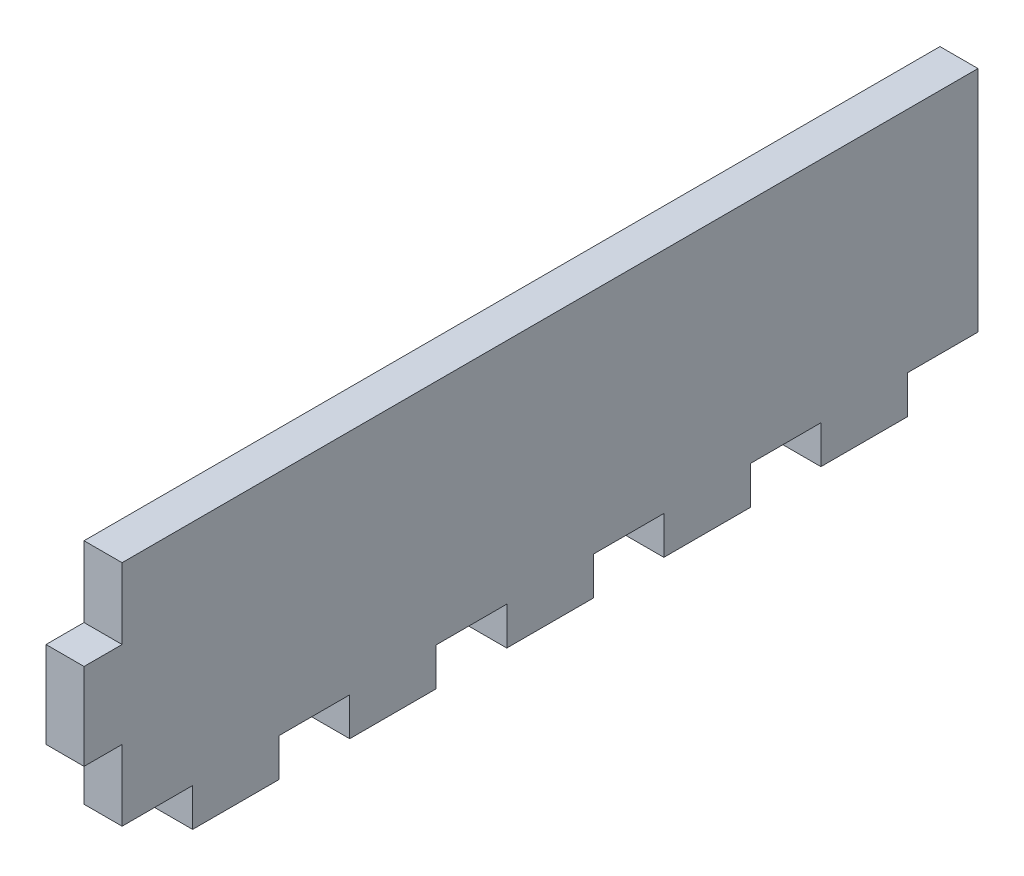
ISO-10303-21;
HEADER;
FILE_DESCRIPTION(('STEP AP214'),'2;1');
FILE_NAME('part.step','',(''),(''),'','','');
FILE_SCHEMA(('AUTOMOTIVE_DESIGN { 1 0 10303 214 1 1 1 1 }'));
ENDSEC;
DATA;
#1=APPLICATION_CONTEXT('core data for automotive mechanical design processes');
#2=APPLICATION_PROTOCOL_DEFINITION('international standard','automotive_design',2000,#1);
#3=PRODUCT_CONTEXT('',#1,'mechanical');
#4=PRODUCT('Part','Part','',(#3));
#5=PRODUCT_RELATED_PRODUCT_CATEGORY('part','',(#4));
#6=PRODUCT_DEFINITION_FORMATION('','',#4);
#7=PRODUCT_DEFINITION_CONTEXT('part definition',#1,'design');
#8=PRODUCT_DEFINITION('design','',#6,#7);
#9=PRODUCT_DEFINITION_SHAPE('','',#8);
#10=(LENGTH_UNIT() NAMED_UNIT(*) SI_UNIT(.MILLI.,.METRE.));
#11=(NAMED_UNIT(*) PLANE_ANGLE_UNIT() SI_UNIT($,.RADIAN.));
#12=(NAMED_UNIT(*) SI_UNIT($,.STERADIAN.) SOLID_ANGLE_UNIT());
#13=UNCERTAINTY_MEASURE_WITH_UNIT(LENGTH_MEASURE(1.E-05),#10,'distance_accuracy_value','');
#14=(GEOMETRIC_REPRESENTATION_CONTEXT(3) GLOBAL_UNCERTAINTY_ASSIGNED_CONTEXT((#13)) GLOBAL_UNIT_ASSIGNED_CONTEXT((#10,
#11,#12)) REPRESENTATION_CONTEXT('',''));
#15=CARTESIAN_POINT('',(0.,0.,0.));
#16=DIRECTION('',(0.,0.,1.));
#17=DIRECTION('',(1.,0.,0.));
#18=AXIS2_PLACEMENT_3D('',#15,#16,#17);
#19=CARTESIAN_POINT('',(-144.425884488404,21.2912626129528,-1.3787865127373));
#20=DIRECTION('',(0.,-1.,0.));
#21=DIRECTION('',(0.,0.,-1.));
#22=AXIS2_PLACEMENT_3D('',#19,#20,#21);
#23=PLANE('',#22);
#24=DIRECTION('',(0.,0.,-1.));
#25=VECTOR('',#24,1.);
#26=CARTESIAN_POINT('',(-140.425884488404,21.2912626129528,-1.3787865127373));
#27=LINE('',#26,#25);
#28=CARTESIAN_POINT('',(-140.425884488404,21.2912626129528,120.507785087741));
#29=VERTEX_POINT('',#28);
#30=CARTESIAN_POINT('',(-140.425884488404,21.2912626129528,116.507785087741));
#31=VERTEX_POINT('',#30);
#32=EDGE_CURVE('E248',#29,#31,#27,.T.);
#33=ORIENTED_EDGE('',*,*,#32,.T.);
#34=DIRECTION('',(1.,0.,0.));
#35=VECTOR('',#34,1.);
#36=CARTESIAN_POINT('',(-144.425884488404,21.2912626129528,116.507785087741));
#37=LINE('',#36,#35);
#38=CARTESIAN_POINT('',(-144.425884488404,21.2912626129528,116.507785087741));
#39=VERTEX_POINT('',#38);
#40=EDGE_CURVE('E11',#39,#31,#37,.T.);
#41=ORIENTED_EDGE('',*,*,#40,.F.);
#42=DIRECTION('',(0.,0.,-1.));
#43=VECTOR('',#42,1.);
#44=CARTESIAN_POINT('',(-144.425884488404,21.2912626129528,-1.3787865127373));
#45=LINE('',#44,#43);
#46=CARTESIAN_POINT('',(-144.425884488404,21.2912626129528,120.507785087741));
#47=VERTEX_POINT('',#46);
#48=EDGE_CURVE('E317',#47,#39,#45,.T.);
#49=ORIENTED_EDGE('',*,*,#48,.F.);
#50=DIRECTION('',(1.,0.,0.));
#51=VECTOR('',#50,1.);
#52=CARTESIAN_POINT('',(-144.425884488404,21.2912626129528,120.507785087741));
#53=LINE('',#52,#51);
#54=EDGE_CURVE('E244',#47,#29,#53,.T.);
#55=ORIENTED_EDGE('',*,*,#54,.T.);
#56=EDGE_LOOP('',(#33,#41,#49,#55));
#57=FACE_BOUND('',#56,.T.);
#58=ADVANCED_FACE('F34',(#57),#23,.F.);
#59=CARTESIAN_POINT('',(-144.425884488404,-176.6951215039,116.507785087741));
#60=DIRECTION('',(0.,0.,-1.));
#61=DIRECTION('',(-1.,0.,0.));
#62=AXIS2_PLACEMENT_3D('',#59,#60,#61);
#63=PLANE('',#62);
#64=DIRECTION('',(0.,1.,0.));
#65=VECTOR('',#64,1.);
#66=CARTESIAN_POINT('',(-140.425884488404,-176.6951215039,116.507785087741));
#67=LINE('',#66,#65);
#68=CARTESIAN_POINT('',(-140.425884488404,28.7412626129528,116.507785087741));
#69=VERTEX_POINT('',#68);
#70=EDGE_CURVE('E251',#31,#69,#67,.T.);
#71=ORIENTED_EDGE('',*,*,#70,.T.);
#72=DIRECTION('',(1.,0.,0.));
#73=VECTOR('',#72,1.);
#74=CARTESIAN_POINT('',(-144.425884488404,28.7412626129528,116.507785087741));
#75=LINE('',#74,#73);
#76=CARTESIAN_POINT('',(-144.425884488404,28.7412626129528,116.507785087741));
#77=VERTEX_POINT('',#76);
#78=EDGE_CURVE('E42',#77,#69,#75,.T.);
#79=ORIENTED_EDGE('',*,*,#78,.F.);
#80=DIRECTION('',(0.,1.,0.));
#81=VECTOR('',#80,1.);
#82=CARTESIAN_POINT('',(-144.425884488404,-176.6951215039,116.507785087741));
#83=LINE('',#82,#81);
#84=EDGE_CURVE('E149',#39,#77,#83,.T.);
#85=ORIENTED_EDGE('',*,*,#84,.F.);
#86=ORIENTED_EDGE('',*,*,#40,.T.);
#87=EDGE_LOOP('',(#71,#79,#85,#86));
#88=FACE_BOUND('',#87,.T.);
#89=ADVANCED_FACE('F380',(#88),#63,.F.);
#90=CARTESIAN_POINT('',(-144.425884488404,28.7412626129528,-1.3787865127373));
#91=DIRECTION('',(0.,1.,0.));
#92=DIRECTION('',(0.,0.,1.));
#93=AXIS2_PLACEMENT_3D('',#90,#91,#92);
#94=PLANE('',#93);
#95=DIRECTION('',(0.,0.,1.));
#96=VECTOR('',#95,1.);
#97=CARTESIAN_POINT('',(-140.425884488404,28.7412626129528,-1.3787865127373));
#98=LINE('',#97,#96);
#99=CARTESIAN_POINT('',(-140.425884488404,28.7412626129528,26.507785087741));
#100=VERTEX_POINT('',#99);
#101=EDGE_CURVE('E254',#100,#69,#98,.T.);
#102=ORIENTED_EDGE('',*,*,#101,.F.);
#103=DIRECTION('',(1.,0.,0.));
#104=VECTOR('',#103,1.);
#105=CARTESIAN_POINT('',(-144.425884488404,28.7412626129528,26.507785087741));
#106=LINE('',#105,#104);
#107=CARTESIAN_POINT('',(-144.425884488404,28.7412626129528,26.507785087741));
#108=VERTEX_POINT('',#107);
#109=EDGE_CURVE('E373',#108,#100,#106,.T.);
#110=ORIENTED_EDGE('',*,*,#109,.F.);
#111=DIRECTION('',(0.,0.,1.));
#112=VECTOR('',#111,1.);
#113=CARTESIAN_POINT('',(-144.425884488404,28.7412626129528,-1.3787865127373));
#114=LINE('',#113,#112);
#115=EDGE_CURVE('E379',#108,#77,#114,.T.);
#116=ORIENTED_EDGE('',*,*,#115,.T.);
#117=ORIENTED_EDGE('',*,*,#78,.T.);
#118=EDGE_LOOP('',(#102,#110,#116,#117));
#119=FACE_BOUND('',#118,.T.);
#120=ADVANCED_FACE('F377',(#119),#94,.T.);
#121=CARTESIAN_POINT('',(-144.425884488404,-176.6951215039,26.507785087741));
#122=DIRECTION('',(0.,0.,-1.));
#123=DIRECTION('',(-1.,0.,0.));
#124=AXIS2_PLACEMENT_3D('',#121,#122,#123);
#125=PLANE('',#124);
#126=DIRECTION('',(0.,1.,0.));
#127=VECTOR('',#126,1.);
#128=CARTESIAN_POINT('',(-140.425884488404,-176.6951215039,26.507785087741));
#129=LINE('',#128,#127);
#130=CARTESIAN_POINT('',(-140.425884488404,4.74126261295282,26.507785087741));
#131=VERTEX_POINT('',#130);
#132=EDGE_CURVE('E257',#131,#100,#129,.T.);
#133=ORIENTED_EDGE('',*,*,#132,.F.);
#134=DIRECTION('',(1.,0.,0.));
#135=VECTOR('',#134,1.);
#136=CARTESIAN_POINT('',(-144.425884488404,4.74126261295282,26.507785087741));
#137=LINE('',#136,#135);
#138=CARTESIAN_POINT('',(-144.425884488404,4.74126261295282,26.507785087741));
#139=VERTEX_POINT('',#138);
#140=EDGE_CURVE('E371',#139,#131,#137,.T.);
#141=ORIENTED_EDGE('',*,*,#140,.F.);
#142=DIRECTION('',(0.,1.,0.));
#143=VECTOR('',#142,1.);
#144=CARTESIAN_POINT('',(-144.425884488404,-176.6951215039,26.507785087741));
#145=LINE('',#144,#143);
#146=EDGE_CURVE('E391',#139,#108,#145,.T.);
#147=ORIENTED_EDGE('',*,*,#146,.T.);
#148=ORIENTED_EDGE('',*,*,#109,.T.);
#149=EDGE_LOOP('',(#133,#141,#147,#148));
#150=FACE_BOUND('',#149,.T.);
#151=ADVANCED_FACE('F388',(#150),#125,.T.);
#152=CARTESIAN_POINT('',(-144.425884488404,4.74126261295282,-1.3787865127373));
#153=DIRECTION('',(0.,-1.,0.));
#154=DIRECTION('',(0.,0.,-1.));
#155=AXIS2_PLACEMENT_3D('',#152,#153,#154);
#156=PLANE('',#155);
#157=DIRECTION('',(0.,0.,-1.));
#158=VECTOR('',#157,1.);
#159=CARTESIAN_POINT('',(-140.425884488404,4.74126261295282,-1.3787865127373));
#160=LINE('',#159,#158);
#161=CARTESIAN_POINT('',(-140.425884488404,4.74126261295282,33.9244517544076));
#162=VERTEX_POINT('',#161);
#163=EDGE_CURVE('E260',#162,#131,#160,.T.);
#164=ORIENTED_EDGE('',*,*,#163,.F.);
#165=DIRECTION('',(1.,0.,0.));
#166=VECTOR('',#165,1.);
#167=CARTESIAN_POINT('',(-144.425884488404,4.74126261295282,33.9244517544076));
#168=LINE('',#167,#166);
#169=CARTESIAN_POINT('',(-144.425884488404,4.74126261295282,33.9244517544076));
#170=VERTEX_POINT('',#169);
#171=EDGE_CURVE('E369',#170,#162,#168,.T.);
#172=ORIENTED_EDGE('',*,*,#171,.F.);
#173=DIRECTION('',(0.,0.,-1.));
#174=VECTOR('',#173,1.);
#175=CARTESIAN_POINT('',(-144.425884488404,4.74126261295282,-1.3787865127373));
#176=LINE('',#175,#174);
#177=EDGE_CURVE('E395',#170,#139,#176,.T.);
#178=ORIENTED_EDGE('',*,*,#177,.T.);
#179=ORIENTED_EDGE('',*,*,#140,.T.);
#180=EDGE_LOOP('',(#164,#172,#178,#179));
#181=FACE_BOUND('',#180,.T.);
#182=ADVANCED_FACE('F481',(#181),#156,.T.);
#183=CARTESIAN_POINT('',(-144.425884488404,-176.6951215039,33.9244517544076));
#184=DIRECTION('',(0.,0.,-1.));
#185=DIRECTION('',(-1.,0.,0.));
#186=AXIS2_PLACEMENT_3D('',#183,#184,#185);
#187=PLANE('',#186);
#188=DIRECTION('',(0.,1.,0.));
#189=VECTOR('',#188,1.);
#190=CARTESIAN_POINT('',(-140.425884488404,-176.6951215039,33.9244517544076));
#191=LINE('',#190,#189);
#192=CARTESIAN_POINT('',(-140.425884488404,0.74126261295282,33.9244517544076));
#193=VERTEX_POINT('',#192);
#194=EDGE_CURVE('E263',#193,#162,#191,.T.);
#195=ORIENTED_EDGE('',*,*,#194,.F.);
#196=DIRECTION('',(1.,0.,0.));
#197=VECTOR('',#196,1.);
#198=CARTESIAN_POINT('',(-144.425884488404,0.74126261295282,33.9244517544076));
#199=LINE('',#198,#197);
#200=CARTESIAN_POINT('',(-144.425884488404,0.74126261295282,33.9244517544076));
#201=VERTEX_POINT('',#200);
#202=EDGE_CURVE('E367',#201,#193,#199,.T.);
#203=ORIENTED_EDGE('',*,*,#202,.F.);
#204=DIRECTION('',(0.,1.,0.));
#205=VECTOR('',#204,1.);
#206=CARTESIAN_POINT('',(-144.425884488404,-176.6951215039,33.9244517544076));
#207=LINE('',#206,#205);
#208=EDGE_CURVE('E401',#201,#170,#207,.T.);
#209=ORIENTED_EDGE('',*,*,#208,.T.);
#210=ORIENTED_EDGE('',*,*,#171,.T.);
#211=EDGE_LOOP('',(#195,#203,#209,#210));
#212=FACE_BOUND('',#211,.T.);
#213=ADVANCED_FACE('F484',(#212),#187,.T.);
#214=CARTESIAN_POINT('',(-144.425884488404,0.74126261295282,-1.3787865127373));
#215=DIRECTION('',(0.,1.,0.));
#216=DIRECTION('',(0.,0.,1.));
#217=AXIS2_PLACEMENT_3D('',#214,#215,#216);
#218=PLANE('',#217);
#219=DIRECTION('',(0.,0.,1.));
#220=VECTOR('',#219,1.);
#221=CARTESIAN_POINT('',(-140.425884488404,0.74126261295282,-1.3787865127373));
#222=LINE('',#221,#220);
#223=CARTESIAN_POINT('',(-140.425884488404,0.74126261295282,43.0244517544077));
#224=VERTEX_POINT('',#223);
#225=EDGE_CURVE('E266',#193,#224,#222,.T.);
#226=ORIENTED_EDGE('',*,*,#225,.T.);
#227=DIRECTION('',(1.,0.,0.));
#228=VECTOR('',#227,1.);
#229=CARTESIAN_POINT('',(-144.425884488404,0.74126261295282,43.0244517544077));
#230=LINE('',#229,#228);
#231=CARTESIAN_POINT('',(-144.425884488404,0.74126261295282,43.0244517544077));
#232=VERTEX_POINT('',#231);
#233=EDGE_CURVE('E364',#232,#224,#230,.T.);
#234=ORIENTED_EDGE('',*,*,#233,.F.);
#235=DIRECTION('',(0.,0.,1.));
#236=VECTOR('',#235,1.);
#237=CARTESIAN_POINT('',(-144.425884488404,0.74126261295282,-1.3787865127373));
#238=LINE('',#237,#236);
#239=EDGE_CURVE('E404',#201,#232,#238,.T.);
#240=ORIENTED_EDGE('',*,*,#239,.F.);
#241=ORIENTED_EDGE('',*,*,#202,.T.);
#242=EDGE_LOOP('',(#226,#234,#240,#241));
#243=FACE_BOUND('',#242,.T.);
#244=ADVANCED_FACE('F488',(#243),#218,.F.);
#245=CARTESIAN_POINT('',(-144.425884488404,-176.6951215039,43.0244517544077));
#246=DIRECTION('',(0.,0.,-1.));
#247=DIRECTION('',(-1.,0.,0.));
#248=AXIS2_PLACEMENT_3D('',#245,#246,#247);
#249=PLANE('',#248);
#250=DIRECTION('',(0.,1.,0.));
#251=VECTOR('',#250,1.);
#252=CARTESIAN_POINT('',(-140.425884488404,-176.6951215039,43.0244517544077));
#253=LINE('',#252,#251);
#254=CARTESIAN_POINT('',(-140.425884488404,4.74126261295282,43.0244517544077));
#255=VERTEX_POINT('',#254);
#256=EDGE_CURVE('E268',#224,#255,#253,.T.);
#257=ORIENTED_EDGE('',*,*,#256,.T.);
#258=DIRECTION('',(1.,0.,0.));
#259=VECTOR('',#258,1.);
#260=CARTESIAN_POINT('',(-144.425884488404,4.74126261295282,43.0244517544077));
#261=LINE('',#260,#259);
#262=CARTESIAN_POINT('',(-144.425884488404,4.74126261295282,43.0244517544077));
#263=VERTEX_POINT('',#262);
#264=EDGE_CURVE('E361',#263,#255,#261,.T.);
#265=ORIENTED_EDGE('',*,*,#264,.F.);
#266=DIRECTION('',(0.,1.,0.));
#267=VECTOR('',#266,1.);
#268=CARTESIAN_POINT('',(-144.425884488404,-176.6951215039,43.0244517544077));
#269=LINE('',#268,#267);
#270=EDGE_CURVE('E406',#232,#263,#269,.T.);
#271=ORIENTED_EDGE('',*,*,#270,.F.);
#272=ORIENTED_EDGE('',*,*,#233,.T.);
#273=EDGE_LOOP('',(#257,#265,#271,#272));
#274=FACE_BOUND('',#273,.T.);
#275=ADVANCED_FACE('F492',(#274),#249,.F.);
#276=CARTESIAN_POINT('',(-144.425884488404,4.74126261295282,-1.3787865127373));
#277=DIRECTION('',(0.,1.,0.));
#278=DIRECTION('',(0.,0.,1.));
#279=AXIS2_PLACEMENT_3D('',#276,#277,#278);
#280=PLANE('',#279);
#281=DIRECTION('',(0.,0.,1.));
#282=VECTOR('',#281,1.);
#283=CARTESIAN_POINT('',(-140.425884488404,4.74126261295282,-1.3787865127373));
#284=LINE('',#283,#282);
#285=CARTESIAN_POINT('',(-140.425884488404,4.74126261295282,50.4411184210743));
#286=VERTEX_POINT('',#285);
#287=EDGE_CURVE('E270',#255,#286,#284,.T.);
#288=ORIENTED_EDGE('',*,*,#287,.T.);
#289=DIRECTION('',(1.,0.,0.));
#290=VECTOR('',#289,1.);
#291=CARTESIAN_POINT('',(-144.425884488404,4.74126261295282,50.4411184210743));
#292=LINE('',#291,#290);
#293=CARTESIAN_POINT('',(-144.425884488404,4.74126261295282,50.4411184210743));
#294=VERTEX_POINT('',#293);
#295=EDGE_CURVE('E359',#294,#286,#292,.T.);
#296=ORIENTED_EDGE('',*,*,#295,.F.);
#297=DIRECTION('',(0.,0.,1.));
#298=VECTOR('',#297,1.);
#299=CARTESIAN_POINT('',(-144.425884488404,4.74126261295282,-1.3787865127373));
#300=LINE('',#299,#298);
#301=EDGE_CURVE('E408',#263,#294,#300,.T.);
#302=ORIENTED_EDGE('',*,*,#301,.F.);
#303=ORIENTED_EDGE('',*,*,#264,.T.);
#304=EDGE_LOOP('',(#288,#296,#302,#303));
#305=FACE_BOUND('',#304,.T.);
#306=ADVANCED_FACE('F496',(#305),#280,.F.);
#307=CARTESIAN_POINT('',(-144.425884488404,-176.6951215039,50.4411184210743));
#308=DIRECTION('',(0.,0.,-1.));
#309=DIRECTION('',(-1.,0.,0.));
#310=AXIS2_PLACEMENT_3D('',#307,#308,#309);
#311=PLANE('',#310);
#312=DIRECTION('',(0.,1.,0.));
#313=VECTOR('',#312,1.);
#314=CARTESIAN_POINT('',(-140.425884488404,-176.6951215039,50.4411184210743));
#315=LINE('',#314,#313);
#316=CARTESIAN_POINT('',(-140.425884488404,0.74126261295282,50.4411184210743));
#317=VERTEX_POINT('',#316);
#318=EDGE_CURVE('E273',#317,#286,#315,.T.);
#319=ORIENTED_EDGE('',*,*,#318,.F.);
#320=DIRECTION('',(1.,0.,0.));
#321=VECTOR('',#320,1.);
#322=CARTESIAN_POINT('',(-144.425884488404,0.74126261295282,50.4411184210743));
#323=LINE('',#322,#321);
#324=CARTESIAN_POINT('',(-144.425884488404,0.74126261295282,50.4411184210743));
#325=VERTEX_POINT('',#324);
#326=EDGE_CURVE('E357',#325,#317,#323,.T.);
#327=ORIENTED_EDGE('',*,*,#326,.F.);
#328=DIRECTION('',(0.,1.,0.));
#329=VECTOR('',#328,1.);
#330=CARTESIAN_POINT('',(-144.425884488404,-176.6951215039,50.4411184210743));
#331=LINE('',#330,#329);
#332=EDGE_CURVE('E410',#325,#294,#331,.T.);
#333=ORIENTED_EDGE('',*,*,#332,.T.);
#334=ORIENTED_EDGE('',*,*,#295,.T.);
#335=EDGE_LOOP('',(#319,#327,#333,#334));
#336=FACE_BOUND('',#335,.T.);
#337=ADVANCED_FACE('F500',(#336),#311,.T.);
#338=CARTESIAN_POINT('',(-144.425884488404,0.74126261295282,-1.3787865127373));
#339=DIRECTION('',(0.,1.,0.));
#340=DIRECTION('',(0.,0.,1.));
#341=AXIS2_PLACEMENT_3D('',#338,#339,#340);
#342=PLANE('',#341);
#343=DIRECTION('',(0.,0.,1.));
#344=VECTOR('',#343,1.);
#345=CARTESIAN_POINT('',(-140.425884488404,0.74126261295282,-1.3787865127373));
#346=LINE('',#345,#344);
#347=CARTESIAN_POINT('',(-140.425884488404,0.74126261295282,59.5411184210743));
#348=VERTEX_POINT('',#347);
#349=EDGE_CURVE('E276',#317,#348,#346,.T.);
#350=ORIENTED_EDGE('',*,*,#349,.T.);
#351=DIRECTION('',(1.,0.,0.));
#352=VECTOR('',#351,1.);
#353=CARTESIAN_POINT('',(-144.425884488404,0.74126261295282,59.5411184210743));
#354=LINE('',#353,#352);
#355=CARTESIAN_POINT('',(-144.425884488404,0.74126261295282,59.5411184210743));
#356=VERTEX_POINT('',#355);
#357=EDGE_CURVE('E354',#356,#348,#354,.T.);
#358=ORIENTED_EDGE('',*,*,#357,.F.);
#359=DIRECTION('',(0.,0.,1.));
#360=VECTOR('',#359,1.);
#361=CARTESIAN_POINT('',(-144.425884488404,0.74126261295282,-1.3787865127373));
#362=LINE('',#361,#360);
#363=EDGE_CURVE('E413',#325,#356,#362,.T.);
#364=ORIENTED_EDGE('',*,*,#363,.F.);
#365=ORIENTED_EDGE('',*,*,#326,.T.);
#366=EDGE_LOOP('',(#350,#358,#364,#365));
#367=FACE_BOUND('',#366,.T.);
#368=ADVANCED_FACE('F504',(#367),#342,.F.);
#369=CARTESIAN_POINT('',(-144.425884488404,-176.6951215039,59.5411184210743));
#370=DIRECTION('',(0.,0.,-1.));
#371=DIRECTION('',(-1.,0.,0.));
#372=AXIS2_PLACEMENT_3D('',#369,#370,#371);
#373=PLANE('',#372);
#374=DIRECTION('',(0.,1.,0.));
#375=VECTOR('',#374,1.);
#376=CARTESIAN_POINT('',(-140.425884488404,-176.6951215039,59.5411184210743));
#377=LINE('',#376,#375);
#378=CARTESIAN_POINT('',(-140.425884488404,4.74126261295282,59.5411184210743));
#379=VERTEX_POINT('',#378);
#380=EDGE_CURVE('E278',#348,#379,#377,.T.);
#381=ORIENTED_EDGE('',*,*,#380,.T.);
#382=DIRECTION('',(1.,0.,0.));
#383=VECTOR('',#382,1.);
#384=CARTESIAN_POINT('',(-144.425884488404,4.74126261295282,59.5411184210743));
#385=LINE('',#384,#383);
#386=CARTESIAN_POINT('',(-144.425884488404,4.74126261295282,59.5411184210743));
#387=VERTEX_POINT('',#386);
#388=EDGE_CURVE('E351',#387,#379,#385,.T.);
#389=ORIENTED_EDGE('',*,*,#388,.F.);
#390=DIRECTION('',(0.,1.,0.));
#391=VECTOR('',#390,1.);
#392=CARTESIAN_POINT('',(-144.425884488404,-176.6951215039,59.5411184210743));
#393=LINE('',#392,#391);
#394=EDGE_CURVE('E415',#356,#387,#393,.T.);
#395=ORIENTED_EDGE('',*,*,#394,.F.);
#396=ORIENTED_EDGE('',*,*,#357,.T.);
#397=EDGE_LOOP('',(#381,#389,#395,#396));
#398=FACE_BOUND('',#397,.T.);
#399=ADVANCED_FACE('F508',(#398),#373,.F.);
#400=CARTESIAN_POINT('',(-144.425884488404,4.74126261295282,-1.3787865127373));
#401=DIRECTION('',(0.,1.,0.));
#402=DIRECTION('',(0.,0.,1.));
#403=AXIS2_PLACEMENT_3D('',#400,#401,#402);
#404=PLANE('',#403);
#405=DIRECTION('',(0.,0.,1.));
#406=VECTOR('',#405,1.);
#407=CARTESIAN_POINT('',(-140.425884488404,4.74126261295282,-1.3787865127373));
#408=LINE('',#407,#406);
#409=CARTESIAN_POINT('',(-140.425884488404,4.74126261295282,66.957785087741));
#410=VERTEX_POINT('',#409);
#411=EDGE_CURVE('E280',#379,#410,#408,.T.);
#412=ORIENTED_EDGE('',*,*,#411,.T.);
#413=DIRECTION('',(1.,0.,0.));
#414=VECTOR('',#413,1.);
#415=CARTESIAN_POINT('',(-144.425884488404,4.74126261295282,66.957785087741));
#416=LINE('',#415,#414);
#417=CARTESIAN_POINT('',(-144.425884488404,4.74126261295282,66.957785087741));
#418=VERTEX_POINT('',#417);
#419=EDGE_CURVE('E349',#418,#410,#416,.T.);
#420=ORIENTED_EDGE('',*,*,#419,.F.);
#421=DIRECTION('',(0.,0.,1.));
#422=VECTOR('',#421,1.);
#423=CARTESIAN_POINT('',(-144.425884488404,4.74126261295282,-1.3787865127373));
#424=LINE('',#423,#422);
#425=EDGE_CURVE('E417',#387,#418,#424,.T.);
#426=ORIENTED_EDGE('',*,*,#425,.F.);
#427=ORIENTED_EDGE('',*,*,#388,.T.);
#428=EDGE_LOOP('',(#412,#420,#426,#427));
#429=FACE_BOUND('',#428,.T.);
#430=ADVANCED_FACE('F512',(#429),#404,.F.);
#431=CARTESIAN_POINT('',(-144.425884488404,-176.6951215039,66.957785087741));
#432=DIRECTION('',(0.,0.,-1.));
#433=DIRECTION('',(-1.,0.,0.));
#434=AXIS2_PLACEMENT_3D('',#431,#432,#433);
#435=PLANE('',#434);
#436=DIRECTION('',(0.,1.,0.));
#437=VECTOR('',#436,1.);
#438=CARTESIAN_POINT('',(-140.425884488404,-176.6951215039,66.957785087741));
#439=LINE('',#438,#437);
#440=CARTESIAN_POINT('',(-140.425884488404,0.74126261295282,66.957785087741));
#441=VERTEX_POINT('',#440);
#442=EDGE_CURVE('E283',#441,#410,#439,.T.);
#443=ORIENTED_EDGE('',*,*,#442,.F.);
#444=DIRECTION('',(1.,0.,0.));
#445=VECTOR('',#444,1.);
#446=CARTESIAN_POINT('',(-144.425884488404,0.74126261295282,66.957785087741));
#447=LINE('',#446,#445);
#448=CARTESIAN_POINT('',(-144.425884488404,0.74126261295282,66.957785087741));
#449=VERTEX_POINT('',#448);
#450=EDGE_CURVE('E347',#449,#441,#447,.T.);
#451=ORIENTED_EDGE('',*,*,#450,.F.);
#452=DIRECTION('',(0.,1.,0.));
#453=VECTOR('',#452,1.);
#454=CARTESIAN_POINT('',(-144.425884488404,-176.6951215039,66.957785087741));
#455=LINE('',#454,#453);
#456=EDGE_CURVE('E419',#449,#418,#455,.T.);
#457=ORIENTED_EDGE('',*,*,#456,.T.);
#458=ORIENTED_EDGE('',*,*,#419,.T.);
#459=EDGE_LOOP('',(#443,#451,#457,#458));
#460=FACE_BOUND('',#459,.T.);
#461=ADVANCED_FACE('F516',(#460),#435,.T.);
#462=CARTESIAN_POINT('',(-144.425884488404,0.74126261295282,-1.3787865127373));
#463=DIRECTION('',(0.,1.,0.));
#464=DIRECTION('',(0.,0.,1.));
#465=AXIS2_PLACEMENT_3D('',#462,#463,#464);
#466=PLANE('',#465);
#467=DIRECTION('',(0.,0.,1.));
#468=VECTOR('',#467,1.);
#469=CARTESIAN_POINT('',(-140.425884488404,0.74126261295282,-1.3787865127373));
#470=LINE('',#469,#468);
#471=CARTESIAN_POINT('',(-140.425884488404,0.74126261295282,76.057785087741));
#472=VERTEX_POINT('',#471);
#473=EDGE_CURVE('E286',#441,#472,#470,.T.);
#474=ORIENTED_EDGE('',*,*,#473,.T.);
#475=DIRECTION('',(1.,0.,0.));
#476=VECTOR('',#475,1.);
#477=CARTESIAN_POINT('',(-144.425884488404,0.74126261295282,76.057785087741));
#478=LINE('',#477,#476);
#479=CARTESIAN_POINT('',(-144.425884488404,0.74126261295282,76.057785087741));
#480=VERTEX_POINT('',#479);
#481=EDGE_CURVE('E344',#480,#472,#478,.T.);
#482=ORIENTED_EDGE('',*,*,#481,.F.);
#483=DIRECTION('',(0.,0.,1.));
#484=VECTOR('',#483,1.);
#485=CARTESIAN_POINT('',(-144.425884488404,0.74126261295282,-1.3787865127373));
#486=LINE('',#485,#484);
#487=EDGE_CURVE('E422',#449,#480,#486,.T.);
#488=ORIENTED_EDGE('',*,*,#487,.F.);
#489=ORIENTED_EDGE('',*,*,#450,.T.);
#490=EDGE_LOOP('',(#474,#482,#488,#489));
#491=FACE_BOUND('',#490,.T.);
#492=ADVANCED_FACE('F520',(#491),#466,.F.);
#493=CARTESIAN_POINT('',(-144.425884488404,-176.6951215039,76.057785087741));
#494=DIRECTION('',(0.,0.,-1.));
#495=DIRECTION('',(-1.,0.,0.));
#496=AXIS2_PLACEMENT_3D('',#493,#494,#495);
#497=PLANE('',#496);
#498=DIRECTION('',(0.,1.,0.));
#499=VECTOR('',#498,1.);
#500=CARTESIAN_POINT('',(-140.425884488404,-176.6951215039,76.057785087741));
#501=LINE('',#500,#499);
#502=CARTESIAN_POINT('',(-140.425884488404,4.74126261295282,76.057785087741));
#503=VERTEX_POINT('',#502);
#504=EDGE_CURVE('E288',#472,#503,#501,.T.);
#505=ORIENTED_EDGE('',*,*,#504,.T.);
#506=DIRECTION('',(1.,0.,0.));
#507=VECTOR('',#506,1.);
#508=CARTESIAN_POINT('',(-144.425884488404,4.74126261295282,76.057785087741));
#509=LINE('',#508,#507);
#510=CARTESIAN_POINT('',(-144.425884488404,4.74126261295282,76.057785087741));
#511=VERTEX_POINT('',#510);
#512=EDGE_CURVE('E341',#511,#503,#509,.T.);
#513=ORIENTED_EDGE('',*,*,#512,.F.);
#514=DIRECTION('',(0.,1.,0.));
#515=VECTOR('',#514,1.);
#516=CARTESIAN_POINT('',(-144.425884488404,-176.6951215039,76.057785087741));
#517=LINE('',#516,#515);
#518=EDGE_CURVE('E424',#480,#511,#517,.T.);
#519=ORIENTED_EDGE('',*,*,#518,.F.);
#520=ORIENTED_EDGE('',*,*,#481,.T.);
#521=EDGE_LOOP('',(#505,#513,#519,#520));
#522=FACE_BOUND('',#521,.T.);
#523=ADVANCED_FACE('F524',(#522),#497,.F.);
#524=CARTESIAN_POINT('',(-144.425884488404,4.74126261295282,-1.3787865127373));
#525=DIRECTION('',(0.,1.,0.));
#526=DIRECTION('',(0.,0.,1.));
#527=AXIS2_PLACEMENT_3D('',#524,#525,#526);
#528=PLANE('',#527);
#529=DIRECTION('',(0.,0.,1.));
#530=VECTOR('',#529,1.);
#531=CARTESIAN_POINT('',(-140.425884488404,4.74126261295282,-1.3787865127373));
#532=LINE('',#531,#530);
#533=CARTESIAN_POINT('',(-140.425884488404,4.74126261295282,83.4744517544076));
#534=VERTEX_POINT('',#533);
#535=EDGE_CURVE('E290',#503,#534,#532,.T.);
#536=ORIENTED_EDGE('',*,*,#535,.T.);
#537=DIRECTION('',(1.,0.,0.));
#538=VECTOR('',#537,1.);
#539=CARTESIAN_POINT('',(-144.425884488404,4.74126261295282,83.4744517544076));
#540=LINE('',#539,#538);
#541=CARTESIAN_POINT('',(-144.425884488404,4.74126261295282,83.4744517544076));
#542=VERTEX_POINT('',#541);
#543=EDGE_CURVE('E339',#542,#534,#540,.T.);
#544=ORIENTED_EDGE('',*,*,#543,.F.);
#545=DIRECTION('',(0.,0.,1.));
#546=VECTOR('',#545,1.);
#547=CARTESIAN_POINT('',(-144.425884488404,4.74126261295282,-1.3787865127373));
#548=LINE('',#547,#546);
#549=EDGE_CURVE('E426',#511,#542,#548,.T.);
#550=ORIENTED_EDGE('',*,*,#549,.F.);
#551=ORIENTED_EDGE('',*,*,#512,.T.);
#552=EDGE_LOOP('',(#536,#544,#550,#551));
#553=FACE_BOUND('',#552,.T.);
#554=ADVANCED_FACE('F528',(#553),#528,.F.);
#555=CARTESIAN_POINT('',(-144.425884488404,-176.6951215039,83.4744517544076));
#556=DIRECTION('',(0.,0.,-1.));
#557=DIRECTION('',(-1.,0.,0.));
#558=AXIS2_PLACEMENT_3D('',#555,#556,#557);
#559=PLANE('',#558);
#560=DIRECTION('',(0.,1.,0.));
#561=VECTOR('',#560,1.);
#562=CARTESIAN_POINT('',(-140.425884488404,-176.6951215039,83.4744517544076));
#563=LINE('',#562,#561);
#564=CARTESIAN_POINT('',(-140.425884488404,0.74126261295282,83.4744517544076));
#565=VERTEX_POINT('',#564);
#566=EDGE_CURVE('E293',#565,#534,#563,.T.);
#567=ORIENTED_EDGE('',*,*,#566,.F.);
#568=DIRECTION('',(1.,0.,0.));
#569=VECTOR('',#568,1.);
#570=CARTESIAN_POINT('',(-144.425884488404,0.74126261295282,83.4744517544076));
#571=LINE('',#570,#569);
#572=CARTESIAN_POINT('',(-144.425884488404,0.74126261295282,83.4744517544076));
#573=VERTEX_POINT('',#572);
#574=EDGE_CURVE('E337',#573,#565,#571,.T.);
#575=ORIENTED_EDGE('',*,*,#574,.F.);
#576=DIRECTION('',(0.,1.,0.));
#577=VECTOR('',#576,1.);
#578=CARTESIAN_POINT('',(-144.425884488404,-176.6951215039,83.4744517544076));
#579=LINE('',#578,#577);
#580=EDGE_CURVE('E428',#573,#542,#579,.T.);
#581=ORIENTED_EDGE('',*,*,#580,.T.);
#582=ORIENTED_EDGE('',*,*,#543,.T.);
#583=EDGE_LOOP('',(#567,#575,#581,#582));
#584=FACE_BOUND('',#583,.T.);
#585=ADVANCED_FACE('F532',(#584),#559,.T.);
#586=CARTESIAN_POINT('',(-144.425884488404,0.74126261295282,-1.3787865127373));
#587=DIRECTION('',(0.,1.,0.));
#588=DIRECTION('',(0.,0.,1.));
#589=AXIS2_PLACEMENT_3D('',#586,#587,#588);
#590=PLANE('',#589);
#591=DIRECTION('',(0.,0.,1.));
#592=VECTOR('',#591,1.);
#593=CARTESIAN_POINT('',(-140.425884488404,0.74126261295282,-1.3787865127373));
#594=LINE('',#593,#592);
#595=CARTESIAN_POINT('',(-140.425884488404,0.74126261295282,92.5744517544076));
#596=VERTEX_POINT('',#595);
#597=EDGE_CURVE('E296',#565,#596,#594,.T.);
#598=ORIENTED_EDGE('',*,*,#597,.T.);
#599=DIRECTION('',(1.,0.,0.));
#600=VECTOR('',#599,1.);
#601=CARTESIAN_POINT('',(-144.425884488404,0.74126261295282,92.5744517544076));
#602=LINE('',#601,#600);
#603=CARTESIAN_POINT('',(-144.425884488404,0.74126261295282,92.5744517544076));
#604=VERTEX_POINT('',#603);
#605=EDGE_CURVE('E334',#604,#596,#602,.T.);
#606=ORIENTED_EDGE('',*,*,#605,.F.);
#607=DIRECTION('',(0.,0.,1.));
#608=VECTOR('',#607,1.);
#609=CARTESIAN_POINT('',(-144.425884488404,0.74126261295282,-1.3787865127373));
#610=LINE('',#609,#608);
#611=EDGE_CURVE('E431',#573,#604,#610,.T.);
#612=ORIENTED_EDGE('',*,*,#611,.F.);
#613=ORIENTED_EDGE('',*,*,#574,.T.);
#614=EDGE_LOOP('',(#598,#606,#612,#613));
#615=FACE_BOUND('',#614,.T.);
#616=ADVANCED_FACE('F536',(#615),#590,.F.);
#617=CARTESIAN_POINT('',(-144.425884488404,-176.6951215039,92.5744517544076));
#618=DIRECTION('',(0.,0.,-1.));
#619=DIRECTION('',(-1.,0.,0.));
#620=AXIS2_PLACEMENT_3D('',#617,#618,#619);
#621=PLANE('',#620);
#622=DIRECTION('',(0.,1.,0.));
#623=VECTOR('',#622,1.);
#624=CARTESIAN_POINT('',(-140.425884488404,-176.6951215039,92.5744517544076));
#625=LINE('',#624,#623);
#626=CARTESIAN_POINT('',(-140.425884488404,4.74126261295282,92.5744517544076));
#627=VERTEX_POINT('',#626);
#628=EDGE_CURVE('E298',#596,#627,#625,.T.);
#629=ORIENTED_EDGE('',*,*,#628,.T.);
#630=DIRECTION('',(1.,0.,0.));
#631=VECTOR('',#630,1.);
#632=CARTESIAN_POINT('',(-144.425884488404,4.74126261295282,92.5744517544076));
#633=LINE('',#632,#631);
#634=CARTESIAN_POINT('',(-144.425884488404,4.74126261295282,92.5744517544076));
#635=VERTEX_POINT('',#634);
#636=EDGE_CURVE('E331',#635,#627,#633,.T.);
#637=ORIENTED_EDGE('',*,*,#636,.F.);
#638=DIRECTION('',(0.,1.,0.));
#639=VECTOR('',#638,1.);
#640=CARTESIAN_POINT('',(-144.425884488404,-176.6951215039,92.5744517544076));
#641=LINE('',#640,#639);
#642=EDGE_CURVE('E433',#604,#635,#641,.T.);
#643=ORIENTED_EDGE('',*,*,#642,.F.);
#644=ORIENTED_EDGE('',*,*,#605,.T.);
#645=EDGE_LOOP('',(#629,#637,#643,#644));
#646=FACE_BOUND('',#645,.T.);
#647=ADVANCED_FACE('F540',(#646),#621,.F.);
#648=CARTESIAN_POINT('',(-144.425884488404,4.74126261295282,-1.3787865127373));
#649=DIRECTION('',(0.,1.,0.));
#650=DIRECTION('',(0.,0.,1.));
#651=AXIS2_PLACEMENT_3D('',#648,#649,#650);
#652=PLANE('',#651);
#653=DIRECTION('',(0.,0.,1.));
#654=VECTOR('',#653,1.);
#655=CARTESIAN_POINT('',(-140.425884488404,4.74126261295282,-1.3787865127373));
#656=LINE('',#655,#654);
#657=CARTESIAN_POINT('',(-140.425884488404,4.74126261295282,99.9911184210743));
#658=VERTEX_POINT('',#657);
#659=EDGE_CURVE('E300',#627,#658,#656,.T.);
#660=ORIENTED_EDGE('',*,*,#659,.T.);
#661=DIRECTION('',(1.,0.,0.));
#662=VECTOR('',#661,1.);
#663=CARTESIAN_POINT('',(-144.425884488404,4.74126261295282,99.9911184210743));
#664=LINE('',#663,#662);
#665=CARTESIAN_POINT('',(-144.425884488404,4.74126261295282,99.9911184210743));
#666=VERTEX_POINT('',#665);
#667=EDGE_CURVE('E329',#666,#658,#664,.T.);
#668=ORIENTED_EDGE('',*,*,#667,.F.);
#669=DIRECTION('',(0.,0.,1.));
#670=VECTOR('',#669,1.);
#671=CARTESIAN_POINT('',(-144.425884488404,4.74126261295282,-1.3787865127373));
#672=LINE('',#671,#670);
#673=EDGE_CURVE('E435',#635,#666,#672,.T.);
#674=ORIENTED_EDGE('',*,*,#673,.F.);
#675=ORIENTED_EDGE('',*,*,#636,.T.);
#676=EDGE_LOOP('',(#660,#668,#674,#675));
#677=FACE_BOUND('',#676,.T.);
#678=ADVANCED_FACE('F544',(#677),#652,.F.);
#679=CARTESIAN_POINT('',(-144.425884488404,-176.6951215039,99.9911184210743));
#680=DIRECTION('',(0.,0.,-1.));
#681=DIRECTION('',(-1.,0.,0.));
#682=AXIS2_PLACEMENT_3D('',#679,#680,#681);
#683=PLANE('',#682);
#684=DIRECTION('',(0.,1.,0.));
#685=VECTOR('',#684,1.);
#686=CARTESIAN_POINT('',(-140.425884488404,-176.6951215039,99.9911184210743));
#687=LINE('',#686,#685);
#688=CARTESIAN_POINT('',(-140.425884488404,0.74126261295282,99.9911184210743));
#689=VERTEX_POINT('',#688);
#690=EDGE_CURVE('E303',#689,#658,#687,.T.);
#691=ORIENTED_EDGE('',*,*,#690,.F.);
#692=DIRECTION('',(1.,0.,0.));
#693=VECTOR('',#692,1.);
#694=CARTESIAN_POINT('',(-144.425884488404,0.74126261295282,99.9911184210743));
#695=LINE('',#694,#693);
#696=CARTESIAN_POINT('',(-144.425884488404,0.74126261295282,99.9911184210743));
#697=VERTEX_POINT('',#696);
#698=EDGE_CURVE('E327',#697,#689,#695,.T.);
#699=ORIENTED_EDGE('',*,*,#698,.F.);
#700=DIRECTION('',(0.,1.,0.));
#701=VECTOR('',#700,1.);
#702=CARTESIAN_POINT('',(-144.425884488404,-176.6951215039,99.9911184210743));
#703=LINE('',#702,#701);
#704=EDGE_CURVE('E437',#697,#666,#703,.T.);
#705=ORIENTED_EDGE('',*,*,#704,.T.);
#706=ORIENTED_EDGE('',*,*,#667,.T.);
#707=EDGE_LOOP('',(#691,#699,#705,#706));
#708=FACE_BOUND('',#707,.T.);
#709=ADVANCED_FACE('F548',(#708),#683,.T.);
#710=CARTESIAN_POINT('',(-144.425884488404,0.74126261295282,-1.3787865127373));
#711=DIRECTION('',(0.,1.,0.));
#712=DIRECTION('',(0.,0.,1.));
#713=AXIS2_PLACEMENT_3D('',#710,#711,#712);
#714=PLANE('',#713);
#715=DIRECTION('',(0.,0.,1.));
#716=VECTOR('',#715,1.);
#717=CARTESIAN_POINT('',(-140.425884488404,0.74126261295282,-1.3787865127373));
#718=LINE('',#717,#716);
#719=CARTESIAN_POINT('',(-140.425884488404,0.74126261295282,109.091118421074));
#720=VERTEX_POINT('',#719);
#721=EDGE_CURVE('E306',#689,#720,#718,.T.);
#722=ORIENTED_EDGE('',*,*,#721,.T.);
#723=DIRECTION('',(1.,0.,0.));
#724=VECTOR('',#723,1.);
#725=CARTESIAN_POINT('',(-144.425884488404,0.74126261295282,109.091118421074));
#726=LINE('',#725,#724);
#727=CARTESIAN_POINT('',(-144.425884488404,0.74126261295282,109.091118421074));
#728=VERTEX_POINT('',#727);
#729=EDGE_CURVE('E324',#728,#720,#726,.T.);
#730=ORIENTED_EDGE('',*,*,#729,.F.);
#731=DIRECTION('',(0.,0.,1.));
#732=VECTOR('',#731,1.);
#733=CARTESIAN_POINT('',(-144.425884488404,0.74126261295282,-1.3787865127373));
#734=LINE('',#733,#732);
#735=EDGE_CURVE('E440',#697,#728,#734,.T.);
#736=ORIENTED_EDGE('',*,*,#735,.F.);
#737=ORIENTED_EDGE('',*,*,#698,.T.);
#738=EDGE_LOOP('',(#722,#730,#736,#737));
#739=FACE_BOUND('',#738,.T.);
#740=ADVANCED_FACE('F552',(#739),#714,.F.);
#741=CARTESIAN_POINT('',(-144.425884488404,-176.6951215039,109.091118421074));
#742=DIRECTION('',(0.,0.,-1.));
#743=DIRECTION('',(-1.,0.,0.));
#744=AXIS2_PLACEMENT_3D('',#741,#742,#743);
#745=PLANE('',#744);
#746=DIRECTION('',(0.,1.,0.));
#747=VECTOR('',#746,1.);
#748=CARTESIAN_POINT('',(-140.425884488404,-176.6951215039,109.091118421074));
#749=LINE('',#748,#747);
#750=CARTESIAN_POINT('',(-140.425884488404,4.74126261295282,109.091118421074));
#751=VERTEX_POINT('',#750);
#752=EDGE_CURVE('E308',#720,#751,#749,.T.);
#753=ORIENTED_EDGE('',*,*,#752,.T.);
#754=DIRECTION('',(1.,0.,0.));
#755=VECTOR('',#754,1.);
#756=CARTESIAN_POINT('',(-144.425884488404,4.74126261295282,109.091118421074));
#757=LINE('',#756,#755);
#758=CARTESIAN_POINT('',(-144.425884488404,4.74126261295282,109.091118421074));
#759=VERTEX_POINT('',#758);
#760=EDGE_CURVE('E321',#759,#751,#757,.T.);
#761=ORIENTED_EDGE('',*,*,#760,.F.);
#762=DIRECTION('',(0.,1.,0.));
#763=VECTOR('',#762,1.);
#764=CARTESIAN_POINT('',(-144.425884488404,-176.6951215039,109.091118421074));
#765=LINE('',#764,#763);
#766=EDGE_CURVE('E442',#728,#759,#765,.T.);
#767=ORIENTED_EDGE('',*,*,#766,.F.);
#768=ORIENTED_EDGE('',*,*,#729,.T.);
#769=EDGE_LOOP('',(#753,#761,#767,#768));
#770=FACE_BOUND('',#769,.T.);
#771=ADVANCED_FACE('F449',(#770),#745,.F.);
#772=CARTESIAN_POINT('',(-144.425884488404,4.74126261295282,-1.3787865127373));
#773=DIRECTION('',(0.,1.,0.));
#774=DIRECTION('',(0.,0.,1.));
#775=AXIS2_PLACEMENT_3D('',#772,#773,#774);
#776=PLANE('',#775);
#777=DIRECTION('',(0.,0.,1.));
#778=VECTOR('',#777,1.);
#779=CARTESIAN_POINT('',(-140.425884488404,4.74126261295282,-1.3787865127373));
#780=LINE('',#779,#778);
#781=CARTESIAN_POINT('',(-140.425884488404,4.74126261295282,116.507785087741));
#782=VERTEX_POINT('',#781);
#783=EDGE_CURVE('E310',#751,#782,#780,.T.);
#784=ORIENTED_EDGE('',*,*,#783,.T.);
#785=DIRECTION('',(1.,0.,0.));
#786=VECTOR('',#785,1.);
#787=CARTESIAN_POINT('',(-144.425884488404,4.74126261295282,116.507785087741));
#788=LINE('',#787,#786);
#789=CARTESIAN_POINT('',(-144.425884488404,4.74126261295282,116.507785087741));
#790=VERTEX_POINT('',#789);
#791=EDGE_CURVE('E234',#790,#782,#788,.T.);
#792=ORIENTED_EDGE('',*,*,#791,.F.);
#793=DIRECTION('',(0.,0.,1.));
#794=VECTOR('',#793,1.);
#795=CARTESIAN_POINT('',(-144.425884488404,4.74126261295282,-1.3787865127373));
#796=LINE('',#795,#794);
#797=EDGE_CURVE('E239',#759,#790,#796,.T.);
#798=ORIENTED_EDGE('',*,*,#797,.F.);
#799=ORIENTED_EDGE('',*,*,#760,.T.);
#800=EDGE_LOOP('',(#784,#792,#798,#799));
#801=FACE_BOUND('',#800,.T.);
#802=ADVANCED_FACE('F453',(#801),#776,.F.);
#803=CARTESIAN_POINT('',(-144.425884488404,-176.6951215039,116.507785087741));
#804=DIRECTION('',(0.,0.,1.));
#805=DIRECTION('',(1.,0.,0.));
#806=AXIS2_PLACEMENT_3D('',#803,#804,#805);
#807=PLANE('',#806);
#808=DIRECTION('',(0.,-1.,0.));
#809=VECTOR('',#808,1.);
#810=CARTESIAN_POINT('',(-140.425884488404,-176.6951215039,116.507785087741));
#811=LINE('',#810,#809);
#812=CARTESIAN_POINT('',(-140.425884488404,12.1912626129528,116.507785087741));
#813=VERTEX_POINT('',#812);
#814=EDGE_CURVE('E229',#813,#782,#811,.T.);
#815=ORIENTED_EDGE('',*,*,#814,.F.);
#816=DIRECTION('',(1.,0.,0.));
#817=VECTOR('',#816,1.);
#818=CARTESIAN_POINT('',(-144.425884488404,12.1912626129528,116.507785087741));
#819=LINE('',#818,#817);
#820=CARTESIAN_POINT('',(-144.425884488404,12.1912626129528,116.507785087741));
#821=VERTEX_POINT('',#820);
#822=EDGE_CURVE('E224',#821,#813,#819,.T.);
#823=ORIENTED_EDGE('',*,*,#822,.F.);
#824=DIRECTION('',(0.,-1.,0.));
#825=VECTOR('',#824,1.);
#826=CARTESIAN_POINT('',(-144.425884488404,-176.6951215039,116.507785087741));
#827=LINE('',#826,#825);
#828=EDGE_CURVE('E227',#821,#790,#827,.T.);
#829=ORIENTED_EDGE('',*,*,#828,.T.);
#830=ORIENTED_EDGE('',*,*,#791,.T.);
#831=EDGE_LOOP('',(#815,#823,#829,#830));
#832=FACE_BOUND('',#831,.T.);
#833=ADVANCED_FACE('F226',(#832),#807,.T.);
#834=CARTESIAN_POINT('',(-144.425884488404,12.1912626129528,-1.37878651273738));
#835=DIRECTION('',(0.,-1.,0.));
#836=DIRECTION('',(0.,0.,-1.));
#837=AXIS2_PLACEMENT_3D('',#834,#835,#836);
#838=PLANE('',#837);
#839=DIRECTION('',(0.,0.,-1.));
#840=VECTOR('',#839,1.);
#841=CARTESIAN_POINT('',(-140.425884488404,12.1912626129528,-1.37878651273738));
#842=LINE('',#841,#840);
#843=CARTESIAN_POINT('',(-140.425884488404,12.1912626129528,120.507785087741));
#844=VERTEX_POINT('',#843);
#845=EDGE_CURVE('E314',#844,#813,#842,.T.);
#846=ORIENTED_EDGE('',*,*,#845,.F.);
#847=DIRECTION('',(1.,0.,0.));
#848=VECTOR('',#847,1.);
#849=CARTESIAN_POINT('',(-144.425884488404,12.1912626129528,120.507785087741));
#850=LINE('',#849,#848);
#851=CARTESIAN_POINT('',(-144.425884488404,12.1912626129528,120.507785087741));
#852=VERTEX_POINT('',#851);
#853=EDGE_CURVE('E138',#852,#844,#850,.T.);
#854=ORIENTED_EDGE('',*,*,#853,.F.);
#855=DIRECTION('',(0.,0.,-1.));
#856=VECTOR('',#855,1.);
#857=CARTESIAN_POINT('',(-144.425884488404,12.1912626129528,-1.37878651273738));
#858=LINE('',#857,#856);
#859=EDGE_CURVE('E237',#852,#821,#858,.T.);
#860=ORIENTED_EDGE('',*,*,#859,.T.);
#861=ORIENTED_EDGE('',*,*,#822,.T.);
#862=EDGE_LOOP('',(#846,#854,#860,#861));
#863=FACE_BOUND('',#862,.T.);
#864=ADVANCED_FACE('F242',(#863),#838,.T.);
#865=CARTESIAN_POINT('',(-144.425884488404,-176.6951215039,120.507785087741));
#866=DIRECTION('',(0.,0.,-1.));
#867=DIRECTION('',(-1.,0.,0.));
#868=AXIS2_PLACEMENT_3D('',#865,#866,#867);
#869=PLANE('',#868);
#870=DIRECTION('',(0.,1.,0.));
#871=VECTOR('',#870,1.);
#872=CARTESIAN_POINT('',(-140.425884488404,-176.6951215039,120.507785087741));
#873=LINE('',#872,#871);
#874=EDGE_CURVE('E141',#844,#29,#873,.T.);
#875=ORIENTED_EDGE('',*,*,#874,.T.);
#876=ORIENTED_EDGE('',*,*,#54,.F.);
#877=DIRECTION('',(0.,1.,0.));
#878=VECTOR('',#877,1.);
#879=CARTESIAN_POINT('',(-144.425884488404,-176.6951215039,120.507785087741));
#880=LINE('',#879,#878);
#881=EDGE_CURVE('E50',#852,#47,#880,.T.);
#882=ORIENTED_EDGE('',*,*,#881,.F.);
#883=ORIENTED_EDGE('',*,*,#853,.T.);
#884=EDGE_LOOP('',(#875,#876,#882,#883));
#885=FACE_BOUND('',#884,.T.);
#886=ADVANCED_FACE('F456',(#885),#869,.F.);
#887=CARTESIAN_POINT('',(-144.425884488404,-176.6951215039,-1.3787865127373));
#888=DIRECTION('',(-1.,0.,0.));
#889=DIRECTION('',(0.,0.,1.));
#890=AXIS2_PLACEMENT_3D('',#887,#888,#889);
#891=PLANE('',#890);
#892=ORIENTED_EDGE('',*,*,#48,.T.);
#893=ORIENTED_EDGE('',*,*,#84,.T.);
#894=ORIENTED_EDGE('',*,*,#115,.F.);
#895=ORIENTED_EDGE('',*,*,#146,.F.);
#896=ORIENTED_EDGE('',*,*,#177,.F.);
#897=ORIENTED_EDGE('',*,*,#208,.F.);
#898=ORIENTED_EDGE('',*,*,#239,.T.);
#899=ORIENTED_EDGE('',*,*,#270,.T.);
#900=ORIENTED_EDGE('',*,*,#301,.T.);
#901=ORIENTED_EDGE('',*,*,#332,.F.);
#902=ORIENTED_EDGE('',*,*,#363,.T.);
#903=ORIENTED_EDGE('',*,*,#394,.T.);
#904=ORIENTED_EDGE('',*,*,#425,.T.);
#905=ORIENTED_EDGE('',*,*,#456,.F.);
#906=ORIENTED_EDGE('',*,*,#487,.T.);
#907=ORIENTED_EDGE('',*,*,#518,.T.);
#908=ORIENTED_EDGE('',*,*,#549,.T.);
#909=ORIENTED_EDGE('',*,*,#580,.F.);
#910=ORIENTED_EDGE('',*,*,#611,.T.);
#911=ORIENTED_EDGE('',*,*,#642,.T.);
#912=ORIENTED_EDGE('',*,*,#673,.T.);
#913=ORIENTED_EDGE('',*,*,#704,.F.);
#914=ORIENTED_EDGE('',*,*,#735,.T.);
#915=ORIENTED_EDGE('',*,*,#766,.T.);
#916=ORIENTED_EDGE('',*,*,#797,.T.);
#917=ORIENTED_EDGE('',*,*,#828,.F.);
#918=ORIENTED_EDGE('',*,*,#859,.F.);
#919=ORIENTED_EDGE('',*,*,#881,.T.);
#920=EDGE_LOOP('',(#892,#893,#894,#895,#896,#897,#898,#899,#900,#901,#902,#903,#904,#905,#906,
#907,#908,#909,#910,#911,#912,#913,#914,#915,#916,#917,#918,#919));
#921=FACE_BOUND('',#920,.T.);
#922=ADVANCED_FACE('F236',(#921),#891,.T.);
#923=CARTESIAN_POINT('',(-140.425884488404,-176.6951215039,-1.3787865127373));
#924=DIRECTION('',(-1.,0.,0.));
#925=DIRECTION('',(0.,0.,1.));
#926=AXIS2_PLACEMENT_3D('',#923,#924,#925);
#927=PLANE('',#926);
#928=ORIENTED_EDGE('',*,*,#32,.F.);
#929=ORIENTED_EDGE('',*,*,#874,.F.);
#930=ORIENTED_EDGE('',*,*,#845,.T.);
#931=ORIENTED_EDGE('',*,*,#814,.T.);
#932=ORIENTED_EDGE('',*,*,#783,.F.);
#933=ORIENTED_EDGE('',*,*,#752,.F.);
#934=ORIENTED_EDGE('',*,*,#721,.F.);
#935=ORIENTED_EDGE('',*,*,#690,.T.);
#936=ORIENTED_EDGE('',*,*,#659,.F.);
#937=ORIENTED_EDGE('',*,*,#628,.F.);
#938=ORIENTED_EDGE('',*,*,#597,.F.);
#939=ORIENTED_EDGE('',*,*,#566,.T.);
#940=ORIENTED_EDGE('',*,*,#535,.F.);
#941=ORIENTED_EDGE('',*,*,#504,.F.);
#942=ORIENTED_EDGE('',*,*,#473,.F.);
#943=ORIENTED_EDGE('',*,*,#442,.T.);
#944=ORIENTED_EDGE('',*,*,#411,.F.);
#945=ORIENTED_EDGE('',*,*,#380,.F.);
#946=ORIENTED_EDGE('',*,*,#349,.F.);
#947=ORIENTED_EDGE('',*,*,#318,.T.);
#948=ORIENTED_EDGE('',*,*,#287,.F.);
#949=ORIENTED_EDGE('',*,*,#256,.F.);
#950=ORIENTED_EDGE('',*,*,#225,.F.);
#951=ORIENTED_EDGE('',*,*,#194,.T.);
#952=ORIENTED_EDGE('',*,*,#163,.T.);
#953=ORIENTED_EDGE('',*,*,#132,.T.);
#954=ORIENTED_EDGE('',*,*,#101,.T.);
#955=ORIENTED_EDGE('',*,*,#70,.F.);
#956=EDGE_LOOP('',(#928,#929,#930,#931,#932,#933,#934,#935,#936,#937,#938,#939,#940,#941,#942,
#943,#944,#945,#946,#947,#948,#949,#950,#951,#952,#953,#954,#955));
#957=FACE_BOUND('',#956,.T.);
#958=ADVANCED_FACE('F384',(#957),#927,.F.);
#959=CLOSED_SHELL('',(#58,#89,#120,#151,#182,#213,#244,#275,#306,#337,#368,#399,#430,#461,#492,
#523,#554,#585,#616,#647,#678,#709,#740,#771,#802,#833,#864,#886,#922,#958));
#960=MANIFOLD_SOLID_BREP('B2',#959);
#961=ADVANCED_BREP_SHAPE_REPRESENTATION('',(#18,#960),#14);
#962=SHAPE_DEFINITION_REPRESENTATION(#9,#961);
ENDSEC;
END-ISO-10303-21;
